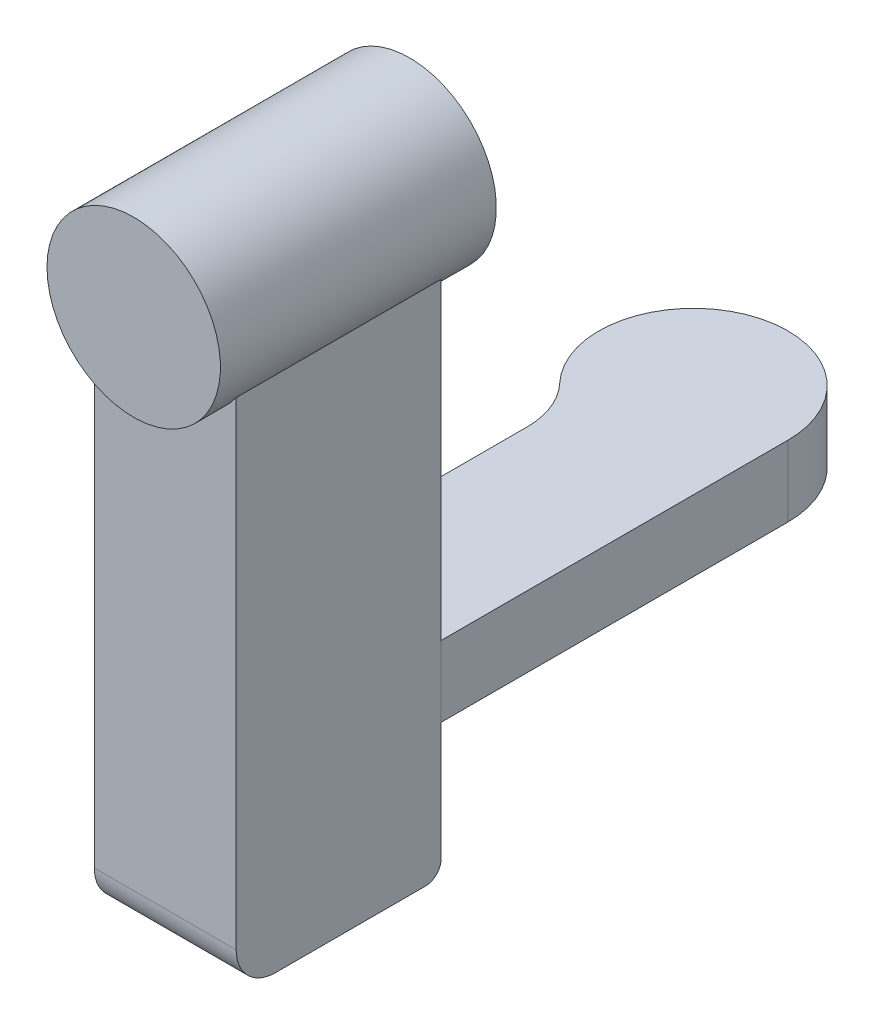
ISO-10303-21;
HEADER;
FILE_DESCRIPTION(('STEP AP214'),'2;1');
FILE_NAME('part.step','',(''),(''),'','','');
FILE_SCHEMA(('AUTOMOTIVE_DESIGN { 1 0 10303 214 1 1 1 1 }'));
ENDSEC;
DATA;
#1=APPLICATION_CONTEXT('core data for automotive mechanical design processes');
#2=APPLICATION_PROTOCOL_DEFINITION('international standard','automotive_design',2000,#1);
#3=PRODUCT_CONTEXT('',#1,'mechanical');
#4=PRODUCT('Part','Part','',(#3));
#5=PRODUCT_RELATED_PRODUCT_CATEGORY('part','',(#4));
#6=PRODUCT_DEFINITION_FORMATION('','',#4);
#7=PRODUCT_DEFINITION_CONTEXT('part definition',#1,'design');
#8=PRODUCT_DEFINITION('design','',#6,#7);
#9=PRODUCT_DEFINITION_SHAPE('','',#8);
#10=(LENGTH_UNIT() NAMED_UNIT(*) SI_UNIT(.MILLI.,.METRE.));
#11=(NAMED_UNIT(*) PLANE_ANGLE_UNIT() SI_UNIT($,.RADIAN.));
#12=(NAMED_UNIT(*) SI_UNIT($,.STERADIAN.) SOLID_ANGLE_UNIT());
#13=UNCERTAINTY_MEASURE_WITH_UNIT(LENGTH_MEASURE(1.E-05),#10,'distance_accuracy_value','');
#14=(GEOMETRIC_REPRESENTATION_CONTEXT(3) GLOBAL_UNCERTAINTY_ASSIGNED_CONTEXT((#13)) GLOBAL_UNIT_ASSIGNED_CONTEXT((#10,
#11,#12)) REPRESENTATION_CONTEXT('',''));
#15=CARTESIAN_POINT('',(0.,0.,0.));
#16=DIRECTION('',(0.,0.,1.));
#17=DIRECTION('',(1.,0.,0.));
#18=AXIS2_PLACEMENT_3D('',#15,#16,#17);
#19=CARTESIAN_POINT('',(0.,-12.,65.));
#20=DIRECTION('',(-1.,0.,0.));
#21=DIRECTION('',(0.,0.,1.));
#22=AXIS2_PLACEMENT_3D('',#19,#20,#21);
#23=CYLINDRICAL_SURFACE('',#22,5.);
#24=DIRECTION('',(-1.,0.,0.));
#25=VECTOR('',#24,1.);
#26=CARTESIAN_POINT('',(0.,-17.,65.));
#27=LINE('',#26,#25);
#28=CARTESIAN_POINT('',(12.,-17.,65.));
#29=VERTEX_POINT('',#28);
#30=CARTESIAN_POINT('',(-5.99999999999999,-17.,65.));
#31=VERTEX_POINT('',#30);
#32=EDGE_CURVE('E137',#29,#31,#27,.T.);
#33=ORIENTED_EDGE('',*,*,#32,.F.);
#34=CARTESIAN_POINT('',(12.,-12.,65.));
#35=DIRECTION('',(1.,0.,0.));
#36=DIRECTION('',(0.,0.,-1.));
#37=AXIS2_PLACEMENT_3D('',#34,#35,#36);
#38=CIRCLE('',#37,5.);
#39=CARTESIAN_POINT('',(12.,-12.,70.));
#40=VERTEX_POINT('',#39);
#41=EDGE_CURVE('E143',#40,#29,#38,.T.);
#42=ORIENTED_EDGE('',*,*,#41,.F.);
#43=DIRECTION('',(-1.,0.,0.));
#44=VECTOR('',#43,1.);
#45=CARTESIAN_POINT('',(12.,-12.,70.));
#46=LINE('',#45,#44);
#47=CARTESIAN_POINT('',(-5.99999999999998,-12.,70.));
#48=VERTEX_POINT('',#47);
#49=EDGE_CURVE('E140',#48,#40,#46,.F.);
#50=ORIENTED_EDGE('',*,*,#49,.F.);
#51=CARTESIAN_POINT('',(-5.99999999999999,-12.,65.));
#52=DIRECTION('',(-1.,0.,0.));
#53=DIRECTION('',(0.,0.,1.));
#54=AXIS2_PLACEMENT_3D('',#51,#52,#53);
#55=CIRCLE('',#54,5.);
#56=EDGE_CURVE('E51',#31,#48,#55,.T.);
#57=ORIENTED_EDGE('',*,*,#56,.F.);
#58=EDGE_LOOP('',(#33,#42,#50,#57));
#59=FACE_BOUND('',#58,.T.);
#60=ADVANCED_FACE('F44',(#59),#23,.T.);
#61=CARTESIAN_POINT('',(12.,-15.,46.));
#62=DIRECTION('',(-1.,0.,0.));
#63=DIRECTION('',(0.,0.,1.));
#64=AXIS2_PLACEMENT_3D('',#61,#62,#63);
#65=CYLINDRICAL_SURFACE('',#64,2.);
#66=DIRECTION('',(-1.,0.,0.));
#67=VECTOR('',#66,1.);
#68=CARTESIAN_POINT('',(12.,-15.,44.));
#69=LINE('',#68,#67);
#70=CARTESIAN_POINT('',(12.,-15.,44.));
#71=VERTEX_POINT('',#70);
#72=CARTESIAN_POINT('',(-5.99999999999999,-15.,44.));
#73=VERTEX_POINT('',#72);
#74=EDGE_CURVE('E104',#71,#73,#69,.T.);
#75=ORIENTED_EDGE('',*,*,#74,.F.);
#76=CARTESIAN_POINT('',(12.,-15.,46.));
#77=DIRECTION('',(1.,0.,0.));
#78=DIRECTION('',(0.,0.,-1.));
#79=AXIS2_PLACEMENT_3D('',#76,#77,#78);
#80=CIRCLE('',#79,2.);
#81=CARTESIAN_POINT('',(12.,-17.,46.));
#82=VERTEX_POINT('',#81);
#83=EDGE_CURVE('E133',#82,#71,#80,.T.);
#84=ORIENTED_EDGE('',*,*,#83,.F.);
#85=DIRECTION('',(-1.,0.,0.));
#86=VECTOR('',#85,1.);
#87=CARTESIAN_POINT('',(0.,-17.,46.));
#88=LINE('',#87,#86);
#89=CARTESIAN_POINT('',(-5.99999999999999,-17.,46.));
#90=VERTEX_POINT('',#89);
#91=EDGE_CURVE('E130',#90,#82,#88,.F.);
#92=ORIENTED_EDGE('',*,*,#91,.F.);
#93=CARTESIAN_POINT('',(-5.99999999999999,-15.,46.));
#94=DIRECTION('',(-1.,0.,0.));
#95=DIRECTION('',(0.,0.,1.));
#96=AXIS2_PLACEMENT_3D('',#93,#94,#95);
#97=CIRCLE('',#96,2.);
#98=EDGE_CURVE('E135',#73,#90,#97,.T.);
#99=ORIENTED_EDGE('',*,*,#98,.F.);
#100=EDGE_LOOP('',(#75,#84,#92,#99));
#101=FACE_BOUND('',#100,.T.);
#102=ADVANCED_FACE('F157',(#101),#65,.T.);
#103=CARTESIAN_POINT('',(12.,-17.,44.));
#104=DIRECTION('',(1.,0.,0.));
#105=DIRECTION('',(0.,0.,-1.));
#106=AXIS2_PLACEMENT_3D('',#103,#104,#105);
#107=PLANE('',#106);
#108=DIRECTION('',(0.,0.,-1.));
#109=VECTOR('',#108,1.);
#110=CARTESIAN_POINT('',(12.,48.6754446796633,74.));
#111=LINE('',#110,#109);
#112=CARTESIAN_POINT('',(12.,48.6754446796633,70.));
#113=VERTEX_POINT('',#112);
#114=CARTESIAN_POINT('',(12.,48.6754446796633,44.));
#115=VERTEX_POINT('',#114);
#116=EDGE_CURVE('E58',#113,#115,#111,.T.);
#117=ORIENTED_EDGE('',*,*,#116,.F.);
#118=DIRECTION('',(0.,1.,0.));
#119=VECTOR('',#118,1.);
#120=CARTESIAN_POINT('',(12.,-17.,70.));
#121=LINE('',#120,#119);
#122=EDGE_CURVE('E125',#40,#113,#121,.T.);
#123=ORIENTED_EDGE('',*,*,#122,.F.);
#124=ORIENTED_EDGE('',*,*,#41,.T.);
#125=DIRECTION('',(0.,0.,-1.));
#126=VECTOR('',#125,1.);
#127=CARTESIAN_POINT('',(12.,-17.,44.));
#128=LINE('',#127,#126);
#129=EDGE_CURVE('E117',#29,#82,#128,.T.);
#130=ORIENTED_EDGE('',*,*,#129,.T.);
#131=ORIENTED_EDGE('',*,*,#83,.T.);
#132=DIRECTION('',(0.,1.,0.));
#133=VECTOR('',#132,1.);
#134=CARTESIAN_POINT('',(12.,-17.,44.));
#135=LINE('',#134,#133);
#136=EDGE_CURVE('E107',#71,#115,#135,.T.);
#137=ORIENTED_EDGE('',*,*,#136,.T.);
#138=EDGE_LOOP('',(#117,#123,#124,#130,#131,#137));
#139=FACE_BOUND('',#138,.T.);
#140=ADVANCED_FACE('F150',(#139),#107,.T.);
#141=CARTESIAN_POINT('',(12.,-17.,70.));
#142=DIRECTION('',(0.,0.,1.));
#143=DIRECTION('',(1.,0.,0.));
#144=AXIS2_PLACEMENT_3D('',#141,#142,#143);
#145=PLANE('',#144);
#146=CARTESIAN_POINT('',(3.00000000000001,55.,70.));
#147=DIRECTION('',(0.,0.,1.));
#148=DIRECTION('',(1.,0.,0.));
#149=AXIS2_PLACEMENT_3D('',#146,#147,#148);
#150=CIRCLE('',#149,11.);
#151=CARTESIAN_POINT('',(-5.99999999999998,48.6754446796632,70.));
#152=VERTEX_POINT('',#151);
#153=EDGE_CURVE('E65',#152,#113,#150,.T.);
#154=ORIENTED_EDGE('',*,*,#153,.F.);
#155=DIRECTION('',(0.,1.,0.));
#156=VECTOR('',#155,1.);
#157=CARTESIAN_POINT('',(-5.99999999999998,-17.,70.));
#158=LINE('',#157,#156);
#159=EDGE_CURVE('E106',#48,#152,#158,.T.);
#160=ORIENTED_EDGE('',*,*,#159,.F.);
#161=ORIENTED_EDGE('',*,*,#49,.T.);
#162=ORIENTED_EDGE('',*,*,#122,.T.);
#163=EDGE_LOOP('',(#154,#160,#161,#162));
#164=FACE_BOUND('',#163,.T.);
#165=ADVANCED_FACE('F148',(#164),#145,.T.);
#166=CARTESIAN_POINT('',(-5.99999999999999,-17.,44.));
#167=DIRECTION('',(-1.,0.,0.));
#168=DIRECTION('',(0.,0.,1.));
#169=AXIS2_PLACEMENT_3D('',#166,#167,#168);
#170=PLANE('',#169);
#171=DIRECTION('',(0.,0.,-1.));
#172=VECTOR('',#171,1.);
#173=CARTESIAN_POINT('',(-5.99999999999998,48.6754446796632,74.));
#174=LINE('',#173,#172);
#175=CARTESIAN_POINT('',(-5.99999999999999,48.6754446796633,44.));
#176=VERTEX_POINT('',#175);
#177=EDGE_CURVE('E110',#176,#152,#174,.F.);
#178=ORIENTED_EDGE('',*,*,#177,.F.);
#179=DIRECTION('',(0.,1.,0.));
#180=VECTOR('',#179,1.);
#181=CARTESIAN_POINT('',(-5.99999999999999,-17.,44.));
#182=LINE('',#181,#180);
#183=EDGE_CURVE('E99',#73,#176,#182,.T.);
#184=ORIENTED_EDGE('',*,*,#183,.F.);
#185=ORIENTED_EDGE('',*,*,#98,.T.);
#186=DIRECTION('',(0.,0.,1.));
#187=VECTOR('',#186,1.);
#188=CARTESIAN_POINT('',(-5.99999999999999,-17.,44.));
#189=LINE('',#188,#187);
#190=EDGE_CURVE('E119',#90,#31,#189,.T.);
#191=ORIENTED_EDGE('',*,*,#190,.T.);
#192=ORIENTED_EDGE('',*,*,#56,.T.);
#193=ORIENTED_EDGE('',*,*,#159,.T.);
#194=EDGE_LOOP('',(#178,#184,#185,#191,#192,#193));
#195=FACE_BOUND('',#194,.T.);
#196=ADVANCED_FACE('F111',(#195),#170,.T.);
#197=CARTESIAN_POINT('',(12.,-17.,44.));
#198=DIRECTION('',(0.,0.,-1.));
#199=DIRECTION('',(-1.,0.,0.));
#200=AXIS2_PLACEMENT_3D('',#197,#198,#199);
#201=PLANE('',#200);
#202=CARTESIAN_POINT('',(3.00000000000001,55.,44.));
#203=DIRECTION('',(0.,0.,-1.));
#204=DIRECTION('',(-1.,0.,0.));
#205=AXIS2_PLACEMENT_3D('',#202,#203,#204);
#206=CIRCLE('',#205,11.);
#207=EDGE_CURVE('E12',#115,#176,#206,.T.);
#208=ORIENTED_EDGE('',*,*,#207,.F.);
#209=ORIENTED_EDGE('',*,*,#136,.F.);
#210=ORIENTED_EDGE('',*,*,#74,.T.);
#211=ORIENTED_EDGE('',*,*,#183,.T.);
#212=EDGE_LOOP('',(#208,#209,#210,#211));
#213=FACE_BOUND('',#212,.T.);
#214=ADVANCED_FACE('F101',(#213),#201,.T.);
#215=CARTESIAN_POINT('',(0.,-17.,0.));
#216=DIRECTION('',(0.,-1.,0.));
#217=DIRECTION('',(0.,0.,-1.));
#218=AXIS2_PLACEMENT_3D('',#215,#216,#217);
#219=PLANE('',#218);
#220=ORIENTED_EDGE('',*,*,#129,.F.);
#221=ORIENTED_EDGE('',*,*,#32,.T.);
#222=ORIENTED_EDGE('',*,*,#190,.F.);
#223=ORIENTED_EDGE('',*,*,#91,.T.);
#224=EDGE_LOOP('',(#220,#221,#222,#223));
#225=FACE_BOUND('',#224,.T.);
#226=ADVANCED_FACE('F169',(#225),#219,.T.);
#227=CARTESIAN_POINT('',(3.00000000000001,55.,74.));
#228=DIRECTION('',(0.,0.,-1.));
#229=DIRECTION('',(-1.,0.,0.));
#230=AXIS2_PLACEMENT_3D('',#227,#228,#229);
#231=CYLINDRICAL_SURFACE('',#230,11.);
#232=ORIENTED_EDGE('',*,*,#153,.T.);
#233=ORIENTED_EDGE('',*,*,#116,.T.);
#234=ORIENTED_EDGE('',*,*,#207,.T.);
#235=ORIENTED_EDGE('',*,*,#177,.T.);
#236=EDGE_LOOP('',(#232,#233,#234,#235));
#237=FACE_BOUND('',#236,.T.);
#238=CARTESIAN_POINT('',(3.00000000000001,55.,74.));
#239=DIRECTION('',(0.,0.,-1.));
#240=DIRECTION('',(-1.,0.,0.));
#241=AXIS2_PLACEMENT_3D('',#238,#239,#240);
#242=CIRCLE('',#241,11.);
#243=CARTESIAN_POINT('',(-7.99999999999999,55.,74.));
#244=VERTEX_POINT('',#243);
#245=EDGE_CURVE('E113',#244,#244,#242,.T.);
#246=ORIENTED_EDGE('',*,*,#245,.T.);
#247=EDGE_LOOP('',(#246));
#248=FACE_BOUND('',#247,.T.);
#249=CARTESIAN_POINT('',(3.00000000000001,55.,39.));
#250=DIRECTION('',(0.,0.,-1.));
#251=DIRECTION('',(-1.,0.,0.));
#252=AXIS2_PLACEMENT_3D('',#249,#250,#251);
#253=CIRCLE('',#252,11.);
#254=CARTESIAN_POINT('',(-7.99999999999999,55.,39.));
#255=VERTEX_POINT('',#254);
#256=EDGE_CURVE('E191',#255,#255,#253,.T.);
#257=ORIENTED_EDGE('',*,*,#256,.F.);
#258=EDGE_LOOP('',(#257));
#259=FACE_BOUND('',#258,.T.);
#260=ADVANCED_FACE('F115',(#237,#248,#259),#231,.T.);
#261=CARTESIAN_POINT('',(3.00000000000001,55.,74.));
#262=DIRECTION('',(0.,0.,-1.));
#263=DIRECTION('',(-1.,0.,0.));
#264=AXIS2_PLACEMENT_3D('',#261,#262,#263);
#265=PLANE('',#264);
#266=ORIENTED_EDGE('',*,*,#245,.F.);
#267=EDGE_LOOP('',(#266));
#268=FACE_BOUND('',#267,.T.);
#269=ADVANCED_FACE('F177',(#268),#265,.F.);
#270=CARTESIAN_POINT('',(3.00000000000001,55.,39.));
#271=DIRECTION('',(0.,0.,-1.));
#272=DIRECTION('',(-1.,0.,0.));
#273=AXIS2_PLACEMENT_3D('',#270,#271,#272);
#274=PLANE('',#273);
#275=ORIENTED_EDGE('',*,*,#256,.T.);
#276=EDGE_LOOP('',(#275));
#277=FACE_BOUND('',#276,.T.);
#278=ADVANCED_FACE('F183',(#277),#274,.T.);
#279=CLOSED_SHELL('',(#60,#102,#140,#165,#196,#214,#226,#260,#269,#278));
#280=MANIFOLD_SOLID_BREP('B2',#279);
#281=CARTESIAN_POINT('',(-16.,9.,15.0996688705415));
#282=DIRECTION('',(0.,-1.,0.));
#283=DIRECTION('',(0.,0.,-1.));
#284=AXIS2_PLACEMENT_3D('',#281,#282,#283);
#285=CYLINDRICAL_SURFACE('',#284,10.);
#286=CARTESIAN_POINT('',(-16.,0.,15.0996688705415));
#287=DIRECTION('',(0.,-1.,0.));
#288=DIRECTION('',(0.,0.,1.));
#289=AXIS2_PLACEMENT_3D('',#286,#287,#288);
#290=CIRCLE('',#289,10.);
#291=CARTESIAN_POINT('',(-8.72727272727273,0.,8.23618302029537));
#292=VERTEX_POINT('',#291);
#293=CARTESIAN_POINT('',(-5.99999999999999,0.,15.0996688705415));
#294=VERTEX_POINT('',#293);
#295=EDGE_CURVE('E323',#292,#294,#290,.T.);
#296=ORIENTED_EDGE('',*,*,#295,.T.);
#297=DIRECTION('',(0.,-1.,0.));
#298=VECTOR('',#297,1.);
#299=CARTESIAN_POINT('',(-5.99999999999999,9.,15.0996688705415));
#300=LINE('',#299,#298);
#301=CARTESIAN_POINT('',(-5.99999999999999,9.,15.0996688705415));
#302=VERTEX_POINT('',#301);
#303=EDGE_CURVE('E42',#302,#294,#300,.T.);
#304=ORIENTED_EDGE('',*,*,#303,.F.);
#305=CARTESIAN_POINT('',(-16.,9.,15.0996688705415));
#306=DIRECTION('',(0.,-1.,0.));
#307=DIRECTION('',(0.,0.,1.));
#308=AXIS2_PLACEMENT_3D('',#305,#306,#307);
#309=CIRCLE('',#308,10.);
#310=CARTESIAN_POINT('',(-8.72727272727273,9.,8.23618302029537));
#311=VERTEX_POINT('',#310);
#312=EDGE_CURVE('E331',#311,#302,#309,.T.);
#313=ORIENTED_EDGE('',*,*,#312,.F.);
#314=DIRECTION('',(0.,-1.,0.));
#315=VECTOR('',#314,1.);
#316=CARTESIAN_POINT('',(-8.72727272727273,9.,8.23618302029537));
#317=LINE('',#316,#315);
#318=EDGE_CURVE('E319',#311,#292,#317,.T.);
#319=ORIENTED_EDGE('',*,*,#318,.T.);
#320=EDGE_LOOP('',(#296,#304,#313,#319));
#321=FACE_BOUND('',#320,.T.);
#322=ADVANCED_FACE('F249',(#321),#285,.F.);
#323=CARTESIAN_POINT('',(-5.99999999999999,9.,44.));
#324=DIRECTION('',(1.,0.,0.));
#325=DIRECTION('',(0.,0.,-1.));
#326=AXIS2_PLACEMENT_3D('',#323,#324,#325);
#327=PLANE('',#326);
#328=DIRECTION('',(0.,0.,1.));
#329=VECTOR('',#328,1.);
#330=CARTESIAN_POINT('',(-5.99999999999999,0.,44.));
#331=LINE('',#330,#329);
#332=CARTESIAN_POINT('',(-5.99999999999999,0.,44.));
#333=VERTEX_POINT('',#332);
#334=EDGE_CURVE('E326',#294,#333,#331,.T.);
#335=ORIENTED_EDGE('',*,*,#334,.T.);
#336=DIRECTION('',(0.,-1.,0.));
#337=VECTOR('',#336,1.);
#338=CARTESIAN_POINT('',(-5.99999999999999,9.,44.));
#339=LINE('',#338,#337);
#340=CARTESIAN_POINT('',(-5.99999999999999,9.,44.));
#341=VERTEX_POINT('',#340);
#342=EDGE_CURVE('E257',#341,#333,#339,.T.);
#343=ORIENTED_EDGE('',*,*,#342,.F.);
#344=DIRECTION('',(0.,0.,1.));
#345=VECTOR('',#344,1.);
#346=CARTESIAN_POINT('',(-5.99999999999999,9.,44.));
#347=LINE('',#346,#345);
#348=EDGE_CURVE('E299',#302,#341,#347,.T.);
#349=ORIENTED_EDGE('',*,*,#348,.F.);
#350=ORIENTED_EDGE('',*,*,#303,.T.);
#351=EDGE_LOOP('',(#335,#343,#349,#350));
#352=FACE_BOUND('',#351,.T.);
#353=ADVANCED_FACE('F350',(#352),#327,.F.);
#354=CARTESIAN_POINT('',(12.,9.,44.));
#355=DIRECTION('',(0.,0.,-1.));
#356=DIRECTION('',(-1.,0.,0.));
#357=AXIS2_PLACEMENT_3D('',#354,#355,#356);
#358=PLANE('',#357);
#359=DIRECTION('',(1.,0.,0.));
#360=VECTOR('',#359,1.);
#361=CARTESIAN_POINT('',(12.,0.,44.));
#362=LINE('',#361,#360);
#363=CARTESIAN_POINT('',(12.,0.,44.));
#364=VERTEX_POINT('',#363);
#365=EDGE_CURVE('E314',#333,#364,#362,.T.);
#366=ORIENTED_EDGE('',*,*,#365,.T.);
#367=DIRECTION('',(0.,-1.,0.));
#368=VECTOR('',#367,1.);
#369=CARTESIAN_POINT('',(12.,9.,44.));
#370=LINE('',#369,#368);
#371=CARTESIAN_POINT('',(12.,9.,44.));
#372=VERTEX_POINT('',#371);
#373=EDGE_CURVE('E311',#372,#364,#370,.T.);
#374=ORIENTED_EDGE('',*,*,#373,.F.);
#375=DIRECTION('',(1.,0.,0.));
#376=VECTOR('',#375,1.);
#377=CARTESIAN_POINT('',(12.,9.,44.));
#378=LINE('',#377,#376);
#379=EDGE_CURVE('E303',#341,#372,#378,.T.);
#380=ORIENTED_EDGE('',*,*,#379,.F.);
#381=ORIENTED_EDGE('',*,*,#342,.T.);
#382=EDGE_LOOP('',(#366,#374,#380,#381));
#383=FACE_BOUND('',#382,.T.);
#384=ADVANCED_FACE('F312',(#383),#358,.F.);
#385=CARTESIAN_POINT('',(12.,9.,0.));
#386=DIRECTION('',(-1.,0.,0.));
#387=DIRECTION('',(0.,0.,1.));
#388=AXIS2_PLACEMENT_3D('',#385,#386,#387);
#389=PLANE('',#388);
#390=DIRECTION('',(0.,0.,-1.));
#391=VECTOR('',#390,1.);
#392=CARTESIAN_POINT('',(12.,0.,0.));
#393=LINE('',#392,#391);
#394=CARTESIAN_POINT('',(12.,0.,0.));
#395=VERTEX_POINT('',#394);
#396=EDGE_CURVE('E285',#364,#395,#393,.T.);
#397=ORIENTED_EDGE('',*,*,#396,.T.);
#398=DIRECTION('',(0.,-1.,0.));
#399=VECTOR('',#398,1.);
#400=CARTESIAN_POINT('',(12.,9.,0.));
#401=LINE('',#400,#399);
#402=CARTESIAN_POINT('',(12.,9.,0.));
#403=VERTEX_POINT('',#402);
#404=EDGE_CURVE('E315',#403,#395,#401,.T.);
#405=ORIENTED_EDGE('',*,*,#404,.F.);
#406=DIRECTION('',(0.,0.,-1.));
#407=VECTOR('',#406,1.);
#408=CARTESIAN_POINT('',(12.,9.,0.));
#409=LINE('',#408,#407);
#410=EDGE_CURVE('E307',#372,#403,#409,.T.);
#411=ORIENTED_EDGE('',*,*,#410,.F.);
#412=ORIENTED_EDGE('',*,*,#373,.T.);
#413=EDGE_LOOP('',(#397,#405,#411,#412));
#414=FACE_BOUND('',#413,.T.);
#415=ADVANCED_FACE('F317',(#414),#389,.F.);
#416=CARTESIAN_POINT('',(0.,9.,0.));
#417=DIRECTION('',(0.,-1.,0.));
#418=DIRECTION('',(0.,0.,-1.));
#419=AXIS2_PLACEMENT_3D('',#416,#417,#418);
#420=CYLINDRICAL_SURFACE('',#419,12.);
#421=CARTESIAN_POINT('',(0.,0.,0.));
#422=DIRECTION('',(0.,1.,0.));
#423=DIRECTION('',(0.,0.,1.));
#424=AXIS2_PLACEMENT_3D('',#421,#422,#423);
#425=CIRCLE('',#424,12.);
#426=EDGE_CURVE('E291',#395,#292,#425,.T.);
#427=ORIENTED_EDGE('',*,*,#426,.T.);
#428=ORIENTED_EDGE('',*,*,#318,.F.);
#429=CARTESIAN_POINT('',(0.,9.,0.));
#430=DIRECTION('',(0.,1.,0.));
#431=DIRECTION('',(0.,0.,1.));
#432=AXIS2_PLACEMENT_3D('',#429,#430,#431);
#433=CIRCLE('',#432,12.);
#434=EDGE_CURVE('E265',#403,#311,#433,.T.);
#435=ORIENTED_EDGE('',*,*,#434,.F.);
#436=ORIENTED_EDGE('',*,*,#404,.T.);
#437=EDGE_LOOP('',(#427,#428,#435,#436));
#438=FACE_BOUND('',#437,.T.);
#439=ADVANCED_FACE('F339',(#438),#420,.T.);
#440=CARTESIAN_POINT('',(-16.,9.,15.0996688705415));
#441=DIRECTION('',(0.,1.,0.));
#442=DIRECTION('',(0.,0.,1.));
#443=AXIS2_PLACEMENT_3D('',#440,#441,#442);
#444=PLANE('',#443);
#445=ORIENTED_EDGE('',*,*,#312,.T.);
#446=ORIENTED_EDGE('',*,*,#348,.T.);
#447=ORIENTED_EDGE('',*,*,#379,.T.);
#448=ORIENTED_EDGE('',*,*,#410,.T.);
#449=ORIENTED_EDGE('',*,*,#434,.T.);
#450=EDGE_LOOP('',(#445,#446,#447,#448,#449));
#451=FACE_BOUND('',#450,.T.);
#452=ADVANCED_FACE('F305',(#451),#444,.T.);
#453=CARTESIAN_POINT('',(-16.,0.,15.0996688705415));
#454=DIRECTION('',(0.,1.,0.));
#455=DIRECTION('',(0.,0.,1.));
#456=AXIS2_PLACEMENT_3D('',#453,#454,#455);
#457=PLANE('',#456);
#458=ORIENTED_EDGE('',*,*,#295,.F.);
#459=ORIENTED_EDGE('',*,*,#426,.F.);
#460=ORIENTED_EDGE('',*,*,#396,.F.);
#461=ORIENTED_EDGE('',*,*,#365,.F.);
#462=ORIENTED_EDGE('',*,*,#334,.F.);
#463=EDGE_LOOP('',(#458,#459,#460,#461,#462));
#464=FACE_BOUND('',#463,.T.);
#465=ADVANCED_FACE('F335',(#464),#457,.F.);
#466=CLOSED_SHELL('',(#322,#353,#384,#415,#439,#452,#465));
#467=MANIFOLD_SOLID_BREP('B6',#466);
#468=ADVANCED_BREP_SHAPE_REPRESENTATION('',(#18,#280,#467),#14);
#469=SHAPE_DEFINITION_REPRESENTATION(#9,#468);
ENDSEC;
END-ISO-10303-21;
